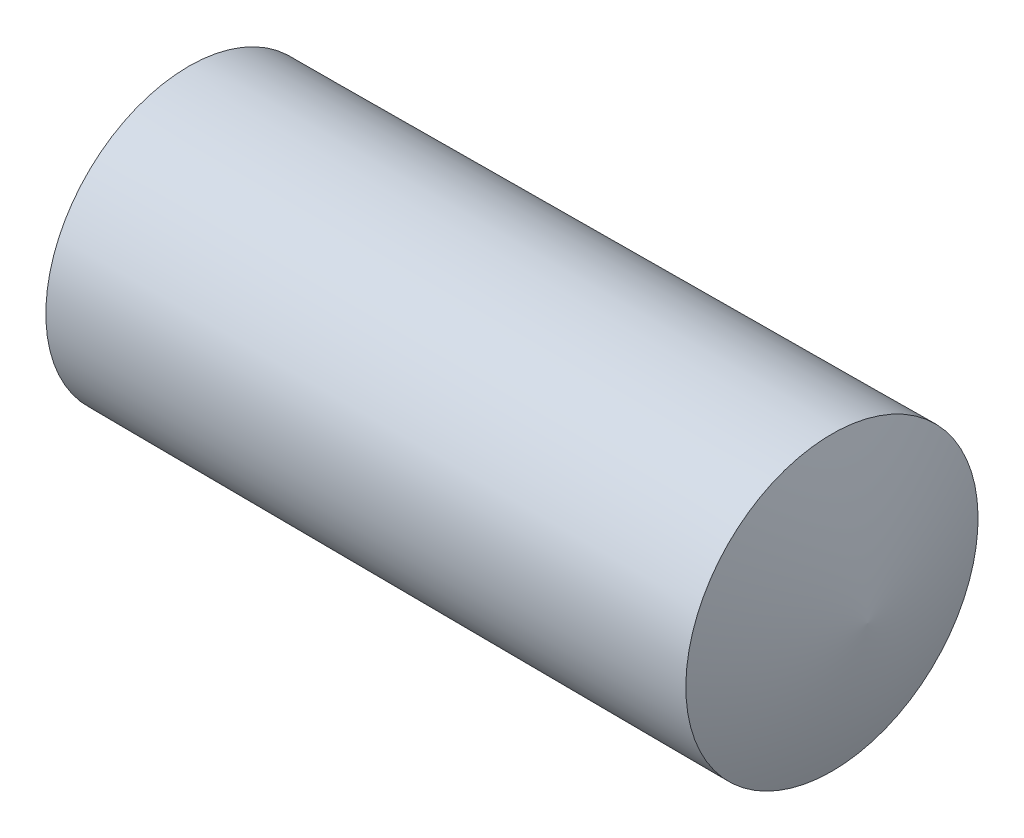
ISO-10303-21;
HEADER;
FILE_DESCRIPTION(('STEP AP214'),'2;1');
FILE_NAME('part.step','',(''),(''),'','','');
FILE_SCHEMA(('AUTOMOTIVE_DESIGN { 1 0 10303 214 1 1 1 1 }'));
ENDSEC;
DATA;
#1=APPLICATION_CONTEXT('core data for automotive mechanical design processes');
#2=APPLICATION_PROTOCOL_DEFINITION('international standard','automotive_design',2000,#1);
#3=PRODUCT_CONTEXT('',#1,'mechanical');
#4=PRODUCT('Part','Part','',(#3));
#5=PRODUCT_RELATED_PRODUCT_CATEGORY('part','',(#4));
#6=PRODUCT_DEFINITION_FORMATION('','',#4);
#7=PRODUCT_DEFINITION_CONTEXT('part definition',#1,'design');
#8=PRODUCT_DEFINITION('design','',#6,#7);
#9=PRODUCT_DEFINITION_SHAPE('','',#8);
#10=(LENGTH_UNIT() NAMED_UNIT(*) SI_UNIT(.MILLI.,.METRE.));
#11=(NAMED_UNIT(*) PLANE_ANGLE_UNIT() SI_UNIT($,.RADIAN.));
#12=(NAMED_UNIT(*) SI_UNIT($,.STERADIAN.) SOLID_ANGLE_UNIT());
#13=UNCERTAINTY_MEASURE_WITH_UNIT(LENGTH_MEASURE(1.E-05),#10,'distance_accuracy_value','');
#14=(GEOMETRIC_REPRESENTATION_CONTEXT(3) GLOBAL_UNCERTAINTY_ASSIGNED_CONTEXT((#13)) GLOBAL_UNIT_ASSIGNED_CONTEXT((#10,
#11,#12)) REPRESENTATION_CONTEXT('',''));
#15=CARTESIAN_POINT('',(0.,0.,0.));
#16=DIRECTION('',(0.,0.,1.));
#17=DIRECTION('',(1.,0.,0.));
#18=AXIS2_PLACEMENT_3D('',#15,#16,#17);
#19=CARTESIAN_POINT('',(5.12644685018009,0.924111712545023,0.));
#20=DIRECTION('',(0.,0.,-1.));
#21=DIRECTION('',(0.,-1.,0.));
#22=AXIS2_PLACEMENT_3D('',#19,#20,#21);
#23=CIRCLE('',#22,8.);
#24=TRIMMED_CURVE('',#23,(PARAMETER_VALUE(-1.45502391486666)),
(PARAMETER_VALUE(1.45502391486666)),.T.,.PARAMETER.);
#25=CARTESIAN_POINT('',(5.12644685018009,0.,0.));
#26=DIRECTION('',(-1.,0.,0.));
#27=AXIS1_PLACEMENT('',#25,#26);
#28=SURFACE_OF_REVOLUTION('',#24,#27);
#29=CARTESIAN_POINT('',(-2.32,0.,0.));
#30=DIRECTION('',(-1.,0.,0.));
#31=DIRECTION('',(0.,-1.,0.));
#32=AXIS2_PLACEMENT_3D('',#29,#30,#31);
#33=CIRCLE('',#32,2.);
#34=CARTESIAN_POINT('',(-2.32,-2.,0.));
#35=VERTEX_POINT('',#34);
#36=EDGE_CURVE('E11',#35,#35,#33,.T.);
#37=ORIENTED_EDGE('',*,*,#36,.T.);
#38=EDGE_LOOP('',(#37));
#39=FACE_BOUND('',#38,.T.);
#40=CARTESIAN_POINT('',(-2.82,0.,0.));
#41=VERTEX_POINT('',#40);
#42=VERTEX_LOOP('',#41);
#43=FACE_BOUND('',#42,.T.);
#44=ADVANCED_FACE('F44',(#39,#43),#28,.T.);
#45=CARTESIAN_POINT('',(-2.32,0.,0.));
#46=DIRECTION('',(1.,0.,0.));
#47=DIRECTION('',(0.,1.,0.));
#48=AXIS2_PLACEMENT_3D('',#45,#46,#47);
#49=CONICAL_SURFACE('',#48,2.,0.0049344917359407);
#50=CARTESIAN_POINT('',(6.68,0.,0.));
#51=DIRECTION('',(-1.,0.,0.));
#52=DIRECTION('',(0.,-1.,0.));
#53=AXIS2_PLACEMENT_3D('',#50,#51,#52);
#54=CIRCLE('',#53,2.04441078607988);
#55=CARTESIAN_POINT('',(6.68,-2.04441078607988,0.));
#56=VERTEX_POINT('',#55);
#57=EDGE_CURVE('E52',#56,#56,#54,.T.);
#58=ORIENTED_EDGE('',*,*,#57,.T.);
#59=EDGE_LOOP('',(#58));
#60=FACE_BOUND('',#59,.T.);
#61=ORIENTED_EDGE('',*,*,#36,.F.);
#62=EDGE_LOOP('',(#61));
#63=FACE_BOUND('',#62,.T.);
#64=ADVANCED_FACE('F61',(#60,#63),#49,.T.);
#65=CARTESIAN_POINT('',(-1.02814336757936,0.924111712545023,0.));
#66=DIRECTION('',(0.,0.,-1.));
#67=DIRECTION('',(0.,-1.,0.));
#68=AXIS2_PLACEMENT_3D('',#65,#66,#67);
#69=CIRCLE('',#68,8.26);
#70=TRIMMED_CURVE('',#69,(PARAMETER_VALUE(-1.45868368116081)),
(PARAMETER_VALUE(1.45868368116081)),.T.,.PARAMETER.);
#71=CARTESIAN_POINT('',(-1.02814336757936,0.,0.));
#72=DIRECTION('',(-1.,0.,0.));
#73=AXIS1_PLACEMENT('',#71,#72);
#74=SURFACE_OF_REVOLUTION('',#70,#73);
#75=CARTESIAN_POINT('',(7.18,0.,0.));
#76=VERTEX_POINT('',#75);
#77=VERTEX_LOOP('',#76);
#78=FACE_BOUND('',#77,.T.);
#79=ORIENTED_EDGE('',*,*,#57,.F.);
#80=EDGE_LOOP('',(#79));
#81=FACE_BOUND('',#80,.T.);
#82=ADVANCED_FACE('F58',(#78,#81),#74,.T.);
#83=CLOSED_SHELL('',(#44,#64,#82));
#84=MANIFOLD_SOLID_BREP('B2',#83);
#85=ADVANCED_BREP_SHAPE_REPRESENTATION('',(#18,#84),#14);
#86=SHAPE_DEFINITION_REPRESENTATION(#9,#85);
ENDSEC;
END-ISO-10303-21;
